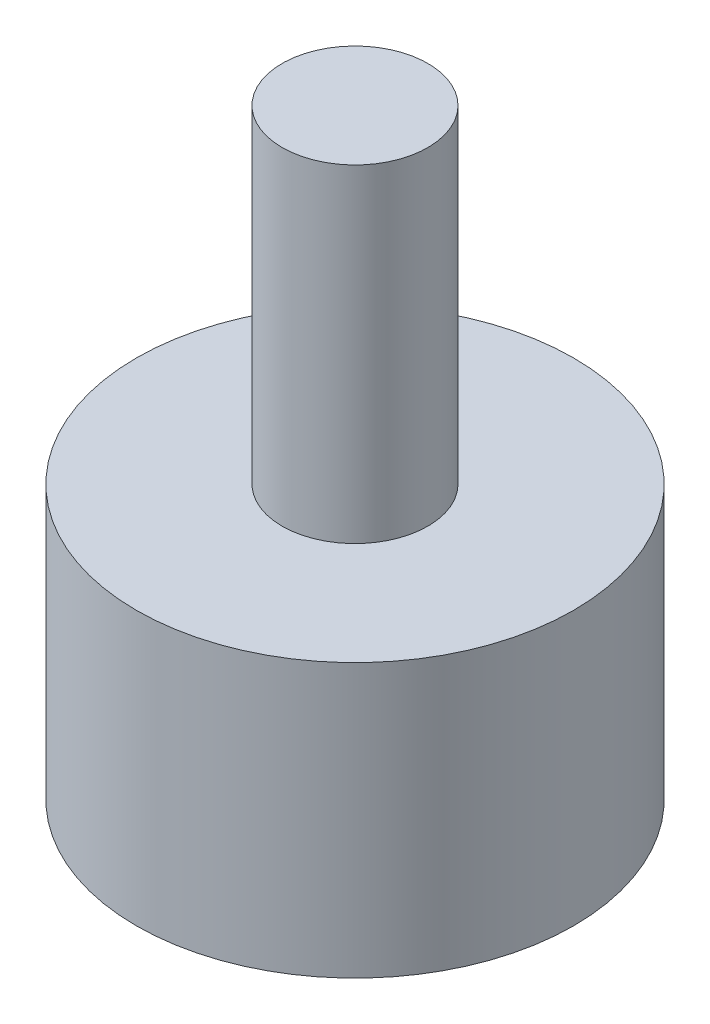
ISO-10303-21;
HEADER;
FILE_DESCRIPTION(('STEP AP214'),'2;1');
FILE_NAME('part.step','',(''),(''),'','','');
FILE_SCHEMA(('AUTOMOTIVE_DESIGN { 1 0 10303 214 1 1 1 1 }'));
ENDSEC;
DATA;
#1=APPLICATION_CONTEXT('core data for automotive mechanical design processes');
#2=APPLICATION_PROTOCOL_DEFINITION('international standard','automotive_design',2000,#1);
#3=PRODUCT_CONTEXT('',#1,'mechanical');
#4=PRODUCT('Part','Part','',(#3));
#5=PRODUCT_RELATED_PRODUCT_CATEGORY('part','',(#4));
#6=PRODUCT_DEFINITION_FORMATION('','',#4);
#7=PRODUCT_DEFINITION_CONTEXT('part definition',#1,'design');
#8=PRODUCT_DEFINITION('design','',#6,#7);
#9=PRODUCT_DEFINITION_SHAPE('','',#8);
#10=(LENGTH_UNIT() NAMED_UNIT(*) SI_UNIT(.MILLI.,.METRE.));
#11=(NAMED_UNIT(*) PLANE_ANGLE_UNIT() SI_UNIT($,.RADIAN.));
#12=(NAMED_UNIT(*) SI_UNIT($,.STERADIAN.) SOLID_ANGLE_UNIT());
#13=UNCERTAINTY_MEASURE_WITH_UNIT(LENGTH_MEASURE(1.E-05),#10,'distance_accuracy_value','');
#14=(GEOMETRIC_REPRESENTATION_CONTEXT(3) GLOBAL_UNCERTAINTY_ASSIGNED_CONTEXT((#13)) GLOBAL_UNIT_ASSIGNED_CONTEXT((#10,
#11,#12)) REPRESENTATION_CONTEXT('',''));
#15=CARTESIAN_POINT('',(0.,0.,0.));
#16=DIRECTION('',(0.,0.,1.));
#17=DIRECTION('',(1.,0.,0.));
#18=AXIS2_PLACEMENT_3D('',#15,#16,#17);
#19=CARTESIAN_POINT('',(0.,0.,0.));
#20=DIRECTION('',(0.,1.,0.));
#21=DIRECTION('',(0.,0.,1.));
#22=AXIS2_PLACEMENT_3D('',#19,#20,#21);
#23=PLANE('',#22);
#24=CARTESIAN_POINT('',(0.,0.,0.));
#25=DIRECTION('',(0.,1.,0.));
#26=DIRECTION('',(0.,0.,1.));
#27=AXIS2_PLACEMENT_3D('',#24,#25,#26);
#28=CIRCLE('',#27,9.88397459621551);
#29=CARTESIAN_POINT('',(0.,0.,9.88397459621551));
#30=VERTEX_POINT('',#29);
#31=EDGE_CURVE('E10',#30,#30,#28,.T.);
#32=ORIENTED_EDGE('',*,*,#31,.T.);
#33=EDGE_LOOP('',(#32));
#34=FACE_BOUND('',#33,.T.);
#35=CARTESIAN_POINT('',(0.,0.,0.));
#36=DIRECTION('',(0.,1.,0.));
#37=DIRECTION('',(0.,0.,1.));
#38=AXIS2_PLACEMENT_3D('',#35,#36,#37);
#39=CIRCLE('',#38,12.);
#40=CARTESIAN_POINT('',(0.,0.,12.));
#41=VERTEX_POINT('',#40);
#42=EDGE_CURVE('E58',#41,#41,#39,.T.);
#43=ORIENTED_EDGE('',*,*,#42,.F.);
#44=EDGE_LOOP('',(#43));
#45=FACE_BOUND('',#44,.T.);
#46=ADVANCED_FACE('F31',(#34,#45),#23,.F.);
#47=CARTESIAN_POINT('',(0.,15.,0.));
#48=DIRECTION('',(0.,1.,0.));
#49=DIRECTION('',(0.,0.,1.));
#50=AXIS2_PLACEMENT_3D('',#47,#48,#49);
#51=PLANE('',#50);
#52=CARTESIAN_POINT('',(0.,15.,0.));
#53=DIRECTION('',(0.,1.,0.));
#54=DIRECTION('',(0.,0.,1.));
#55=AXIS2_PLACEMENT_3D('',#52,#53,#54);
#56=CIRCLE('',#55,12.);
#57=CARTESIAN_POINT('',(0.,15.,12.));
#58=VERTEX_POINT('',#57);
#59=EDGE_CURVE('E47',#58,#58,#56,.T.);
#60=ORIENTED_EDGE('',*,*,#59,.T.);
#61=EDGE_LOOP('',(#60));
#62=FACE_BOUND('',#61,.T.);
#63=CARTESIAN_POINT('',(0.,15.,0.));
#64=DIRECTION('',(0.,1.,0.));
#65=DIRECTION('',(0.,0.,1.));
#66=AXIS2_PLACEMENT_3D('',#63,#64,#65);
#67=CIRCLE('',#66,4.);
#68=CARTESIAN_POINT('',(0.,15.,4.));
#69=VERTEX_POINT('',#68);
#70=EDGE_CURVE('E57',#69,#69,#67,.T.);
#71=ORIENTED_EDGE('',*,*,#70,.F.);
#72=EDGE_LOOP('',(#71));
#73=FACE_BOUND('',#72,.T.);
#74=ADVANCED_FACE('F100',(#62,#73),#51,.T.);
#75=CARTESIAN_POINT('',(0.,15.,0.));
#76=DIRECTION('',(0.,-1.,0.));
#77=DIRECTION('',(0.,0.,-1.));
#78=AXIS2_PLACEMENT_3D('',#75,#76,#77);
#79=CYLINDRICAL_SURFACE('',#78,12.);
#80=ORIENTED_EDGE('',*,*,#59,.F.);
#81=EDGE_LOOP('',(#80));
#82=FACE_BOUND('',#81,.T.);
#83=ORIENTED_EDGE('',*,*,#42,.T.);
#84=EDGE_LOOP('',(#83));
#85=FACE_BOUND('',#84,.T.);
#86=ADVANCED_FACE('F98',(#82,#85),#79,.T.);
#87=CARTESIAN_POINT('',(0.,33.,0.));
#88=DIRECTION('',(0.,-1.,0.));
#89=DIRECTION('',(0.,0.,-1.));
#90=AXIS2_PLACEMENT_3D('',#87,#88,#89);
#91=CYLINDRICAL_SURFACE('',#90,4.);
#92=CARTESIAN_POINT('',(0.,33.,0.));
#93=DIRECTION('',(0.,1.,0.));
#94=DIRECTION('',(0.,0.,1.));
#95=AXIS2_PLACEMENT_3D('',#92,#93,#94);
#96=CIRCLE('',#95,4.);
#97=CARTESIAN_POINT('',(0.,33.,4.));
#98=VERTEX_POINT('',#97);
#99=EDGE_CURVE('E61',#98,#98,#96,.T.);
#100=ORIENTED_EDGE('',*,*,#99,.F.);
#101=EDGE_LOOP('',(#100));
#102=FACE_BOUND('',#101,.T.);
#103=ORIENTED_EDGE('',*,*,#70,.T.);
#104=EDGE_LOOP('',(#103));
#105=FACE_BOUND('',#104,.T.);
#106=ADVANCED_FACE('F94',(#102,#105),#91,.T.);
#107=CARTESIAN_POINT('',(0.,33.,0.));
#108=DIRECTION('',(0.,1.,0.));
#109=DIRECTION('',(0.,0.,1.));
#110=AXIS2_PLACEMENT_3D('',#107,#108,#109);
#111=PLANE('',#110);
#112=ORIENTED_EDGE('',*,*,#99,.T.);
#113=EDGE_LOOP('',(#112));
#114=FACE_BOUND('',#113,.T.);
#115=ADVANCED_FACE('F90',(#114),#111,.T.);
#116=CARTESIAN_POINT('',(0.,-1.5,0.));
#117=DIRECTION('',(0.,1.,0.));
#118=DIRECTION('',(0.,0.,1.));
#119=AXIS2_PLACEMENT_3D('',#116,#117,#118);
#120=CYLINDRICAL_SURFACE('',#119,7.5);
#121=CARTESIAN_POINT('',(0.,-1.37638837486624,0.));
#122=DIRECTION('',(0.,1.,0.));
#123=DIRECTION('',(0.,0.,1.));
#124=AXIS2_PLACEMENT_3D('',#121,#122,#123);
#125=CIRCLE('',#124,7.5);
#126=CARTESIAN_POINT('',(0.,-1.37638837486624,7.5));
#127=VERTEX_POINT('',#126);
#128=EDGE_CURVE('E39',#127,#127,#125,.F.);
#129=ORIENTED_EDGE('',*,*,#128,.T.);
#130=EDGE_LOOP('',(#129));
#131=FACE_BOUND('',#130,.T.);
#132=CARTESIAN_POINT('',(0.,-0.783882181415011,0.));
#133=DIRECTION('',(0.,1.,0.));
#134=DIRECTION('',(0.,0.,1.));
#135=AXIS2_PLACEMENT_3D('',#132,#133,#134);
#136=CIRCLE('',#135,7.5);
#137=CARTESIAN_POINT('',(0.,-0.783882181415011,7.5));
#138=VERTEX_POINT('',#137);
#139=EDGE_CURVE('E43',#138,#138,#136,.T.);
#140=ORIENTED_EDGE('',*,*,#139,.T.);
#141=EDGE_LOOP('',(#140));
#142=FACE_BOUND('',#141,.T.);
#143=ADVANCED_FACE('F93',(#131,#142),#120,.F.);
#144=CARTESIAN_POINT('',(0.,2.,0.));
#145=DIRECTION('',(0.,0.,1.));
#146=DIRECTION('',(1.,0.,0.));
#147=AXIS2_PLACEMENT_3D('',#144,#145,#146);
#148=SPHERICAL_SURFACE('',#147,8.);
#149=CARTESIAN_POINT('',(0.,2.,0.));
#150=DIRECTION('',(0.,1.,0.));
#151=DIRECTION('',(0.,0.,1.));
#152=AXIS2_PLACEMENT_3D('',#149,#150,#151);
#153=SPHERICAL_SURFACE('',#152,8.);
#154=ORIENTED_EDGE('',*,*,#139,.F.);
#155=EDGE_LOOP('',(#154));
#156=FACE_BOUND('',#155,.T.);
#157=ADVANCED_FACE('F86',(#156),#153,.T.);
#158=CARTESIAN_POINT('',(0.,-1.5,0.));
#159=DIRECTION('',(0.,1.,0.));
#160=DIRECTION('',(0.,0.,1.));
#161=AXIS2_PLACEMENT_3D('',#158,#159,#160);
#162=CONICAL_SURFACE('',#161,7.28589838486217,1.0471975511966);
#163=ORIENTED_EDGE('',*,*,#31,.F.);
#164=EDGE_LOOP('',(#163));
#165=FACE_BOUND('',#164,.T.);
#166=ORIENTED_EDGE('',*,*,#128,.F.);
#167=EDGE_LOOP('',(#166));
#168=FACE_BOUND('',#167,.T.);
#169=ADVANCED_FACE('F33',(#165,#168),#162,.T.);
#170=CLOSED_SHELL('',(#46,#74,#86,#106,#115,#143,#157,#169));
#171=CARTESIAN_POINT('',(0.,2.,0.));
#172=DIRECTION('',(0.,-1.,0.));
#173=DIRECTION('',(0.,0.,-1.));
#174=AXIS2_PLACEMENT_3D('',#171,#172,#173);
#175=SPHERICAL_SURFACE('',#174,8.);
#176=CARTESIAN_POINT('',(0.,2.,0.));
#177=DIRECTION('',(0.,-1.,0.));
#178=DIRECTION('',(0.,0.,-1.));
#179=AXIS2_PLACEMENT_3D('',#176,#177,#178);
#180=CIRCLE('',#179,8.);
#181=CARTESIAN_POINT('',(0.,2.,-8.));
#182=VERTEX_POINT('',#181);
#183=EDGE_CURVE('E54',#182,#182,#180,.T.);
#184=ORIENTED_EDGE('',*,*,#183,.T.);
#185=EDGE_LOOP('',(#184));
#186=FACE_BOUND('',#185,.T.);
#187=CARTESIAN_POINT('',(0.,0.,0.));
#188=DIRECTION('',(0.,-1.,0.));
#189=DIRECTION('',(0.,0.,-1.));
#190=AXIS2_PLACEMENT_3D('',#187,#188,#189);
#191=CIRCLE('',#190,7.74596669241483);
#192=CARTESIAN_POINT('',(0.,0.,-7.74596669241483));
#193=VERTEX_POINT('',#192);
#194=EDGE_CURVE('E50',#193,#193,#191,.F.);
#195=ORIENTED_EDGE('',*,*,#194,.T.);
#196=EDGE_LOOP('',(#195));
#197=FACE_BOUND('',#196,.T.);
#198=ADVANCED_FACE('F75',(#186,#197),#175,.T.);
#199=CARTESIAN_POINT('',(0.,2.,0.));
#200=DIRECTION('',(0.,-1.,0.));
#201=DIRECTION('',(0.,0.,-1.));
#202=AXIS2_PLACEMENT_3D('',#199,#200,#201);
#203=CYLINDRICAL_SURFACE('',#202,8.);
#204=ORIENTED_EDGE('',*,*,#183,.F.);
#205=EDGE_LOOP('',(#204));
#206=FACE_BOUND('',#205,.T.);
#207=CARTESIAN_POINT('',(0.,0.,0.));
#208=DIRECTION('',(0.,-1.,0.));
#209=DIRECTION('',(0.,0.,-1.));
#210=AXIS2_PLACEMENT_3D('',#207,#208,#209);
#211=CIRCLE('',#210,8.);
#212=CARTESIAN_POINT('',(0.,0.,-8.));
#213=VERTEX_POINT('',#212);
#214=EDGE_CURVE('E52',#213,#213,#211,.F.);
#215=ORIENTED_EDGE('',*,*,#214,.F.);
#216=EDGE_LOOP('',(#215));
#217=FACE_BOUND('',#216,.T.);
#218=ADVANCED_FACE('F73',(#206,#217),#203,.F.);
#219=CARTESIAN_POINT('',(0.,0.,0.));
#220=DIRECTION('',(0.,-1.,0.));
#221=DIRECTION('',(0.,0.,-1.));
#222=AXIS2_PLACEMENT_3D('',#219,#220,#221);
#223=PLANE('',#222);
#224=ORIENTED_EDGE('',*,*,#194,.F.);
#225=EDGE_LOOP('',(#224));
#226=FACE_BOUND('',#225,.T.);
#227=ORIENTED_EDGE('',*,*,#214,.T.);
#228=EDGE_LOOP('',(#227));
#229=FACE_BOUND('',#228,.T.);
#230=ADVANCED_FACE('F71',(#226,#229),#223,.F.);
#231=CLOSED_SHELL('',(#198,#218,#230));
#232=ORIENTED_CLOSED_SHELL('',*,#231,.T.);
#233=BREP_WITH_VOIDS('B2',#170,(#232));
#234=ADVANCED_BREP_SHAPE_REPRESENTATION('',(#18,#233),#14);
#235=SHAPE_DEFINITION_REPRESENTATION(#9,#234);
ENDSEC;
END-ISO-10303-21;
